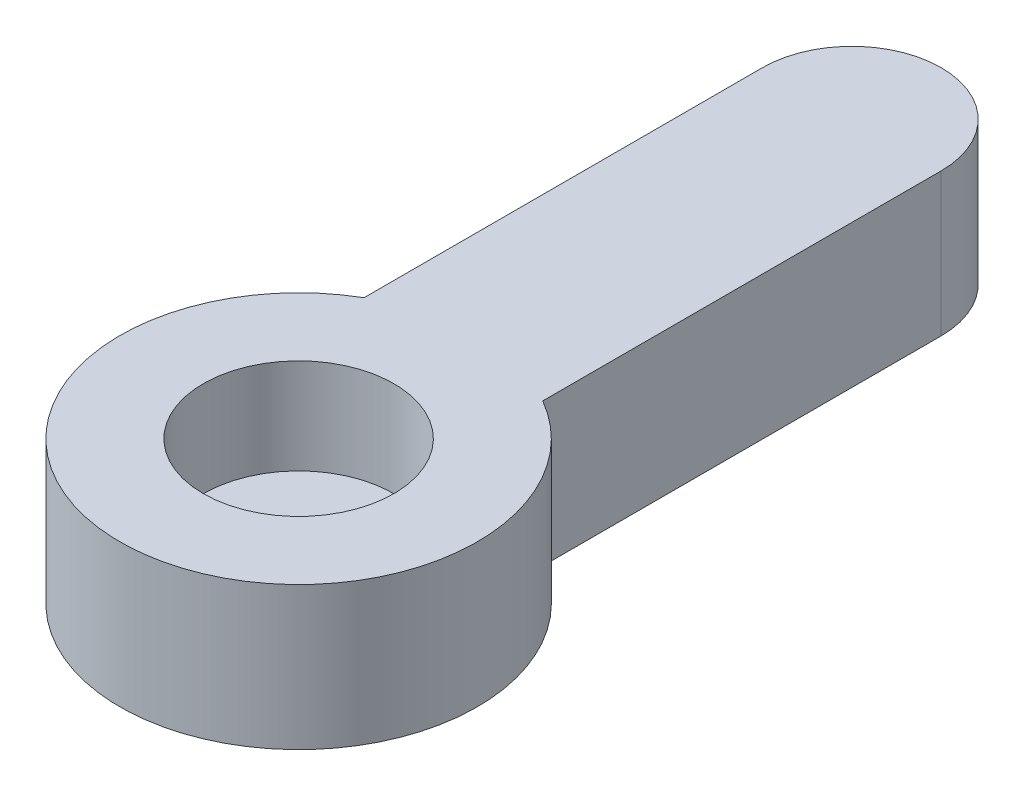
ISO-10303-21;
HEADER;
FILE_DESCRIPTION(('STEP AP214'),'2;1');
FILE_NAME('part.step','',(''),(''),'','','');
FILE_SCHEMA(('AUTOMOTIVE_DESIGN { 1 0 10303 214 1 1 1 1 }'));
ENDSEC;
DATA;
#1=APPLICATION_CONTEXT('core data for automotive mechanical design processes');
#2=APPLICATION_PROTOCOL_DEFINITION('international standard','automotive_design',2000,#1);
#3=PRODUCT_CONTEXT('',#1,'mechanical');
#4=PRODUCT('Part','Part','',(#3));
#5=PRODUCT_RELATED_PRODUCT_CATEGORY('part','',(#4));
#6=PRODUCT_DEFINITION_FORMATION('','',#4);
#7=PRODUCT_DEFINITION_CONTEXT('part definition',#1,'design');
#8=PRODUCT_DEFINITION('design','',#6,#7);
#9=PRODUCT_DEFINITION_SHAPE('','',#8);
#10=(LENGTH_UNIT() NAMED_UNIT(*) SI_UNIT(.MILLI.,.METRE.));
#11=(NAMED_UNIT(*) PLANE_ANGLE_UNIT() SI_UNIT($,.RADIAN.));
#12=(NAMED_UNIT(*) SI_UNIT($,.STERADIAN.) SOLID_ANGLE_UNIT());
#13=UNCERTAINTY_MEASURE_WITH_UNIT(LENGTH_MEASURE(1.E-05),#10,'distance_accuracy_value','');
#14=(GEOMETRIC_REPRESENTATION_CONTEXT(3) GLOBAL_UNCERTAINTY_ASSIGNED_CONTEXT((#13)) GLOBAL_UNIT_ASSIGNED_CONTEXT((#10,
#11,#12)) REPRESENTATION_CONTEXT('',''));
#15=CARTESIAN_POINT('',(0.,0.,0.));
#16=DIRECTION('',(0.,0.,1.));
#17=DIRECTION('',(1.,0.,0.));
#18=AXIS2_PLACEMENT_3D('',#15,#16,#17);
#19=CARTESIAN_POINT('',(-3.75,6.,-13.9951905283833));
#20=DIRECTION('',(-1.,0.,0.));
#21=DIRECTION('',(0.,0.,1.));
#22=AXIS2_PLACEMENT_3D('',#19,#20,#21);
#23=PLANE('',#22);
#24=DIRECTION('',(0.,0.,-1.));
#25=VECTOR('',#24,1.);
#26=CARTESIAN_POINT('',(-3.75,0.,-13.9951905283833));
#27=LINE('',#26,#25);
#28=CARTESIAN_POINT('',(-3.75,0.,-13.9951905283833));
#29=VERTEX_POINT('',#28);
#30=CARTESIAN_POINT('',(-3.75,0.,-30.718752221774));
#31=VERTEX_POINT('',#30);
#32=EDGE_CURVE('E107',#29,#31,#27,.T.);
#33=ORIENTED_EDGE('',*,*,#32,.F.);
#34=DIRECTION('',(0.,-1.,0.));
#35=VECTOR('',#34,1.);
#36=CARTESIAN_POINT('',(-3.75,6.,-13.9951905283833));
#37=LINE('',#36,#35);
#38=CARTESIAN_POINT('',(-3.75,6.,-13.9951905283833));
#39=VERTEX_POINT('',#38);
#40=EDGE_CURVE('E11',#39,#29,#37,.T.);
#41=ORIENTED_EDGE('',*,*,#40,.F.);
#42=DIRECTION('',(0.,0.,-1.));
#43=VECTOR('',#42,1.);
#44=CARTESIAN_POINT('',(-3.75,6.,-13.9951905283833));
#45=LINE('',#44,#43);
#46=CARTESIAN_POINT('',(-3.75,6.,-30.718752221774));
#47=VERTEX_POINT('',#46);
#48=EDGE_CURVE('E101',#39,#47,#45,.T.);
#49=ORIENTED_EDGE('',*,*,#48,.T.);
#50=DIRECTION('',(0.,-1.,0.));
#51=VECTOR('',#50,1.);
#52=CARTESIAN_POINT('',(-3.75,6.,-30.718752221774));
#53=LINE('',#52,#51);
#54=EDGE_CURVE('E44',#47,#31,#53,.T.);
#55=ORIENTED_EDGE('',*,*,#54,.T.);
#56=EDGE_LOOP('',(#33,#41,#49,#55));
#57=FACE_BOUND('',#56,.T.);
#58=ADVANCED_FACE('F41',(#57),#23,.T.);
#59=CARTESIAN_POINT('',(0.,6.,-7.5));
#60=DIRECTION('',(0.,-1.,0.));
#61=DIRECTION('',(0.,0.,-1.));
#62=AXIS2_PLACEMENT_3D('',#59,#60,#61);
#63=CYLINDRICAL_SURFACE('',#62,7.5);
#64=CARTESIAN_POINT('',(0.,0.,-7.5));
#65=DIRECTION('',(0.,1.,0.));
#66=DIRECTION('',(0.,0.,1.));
#67=AXIS2_PLACEMENT_3D('',#64,#65,#66);
#68=CIRCLE('',#67,7.5);
#69=CARTESIAN_POINT('',(3.75,0.,-13.9951905283833));
#70=VERTEX_POINT('',#69);
#71=EDGE_CURVE('E74',#29,#70,#68,.T.);
#72=ORIENTED_EDGE('',*,*,#71,.T.);
#73=DIRECTION('',(0.,-1.,0.));
#74=VECTOR('',#73,1.);
#75=CARTESIAN_POINT('',(3.75,6.,-13.9951905283833));
#76=LINE('',#75,#74);
#77=CARTESIAN_POINT('',(3.75,6.,-13.9951905283833));
#78=VERTEX_POINT('',#77);
#79=EDGE_CURVE('E50',#78,#70,#76,.T.);
#80=ORIENTED_EDGE('',*,*,#79,.F.);
#81=CARTESIAN_POINT('',(0.,6.,-7.5));
#82=DIRECTION('',(0.,1.,0.));
#83=DIRECTION('',(0.,0.,1.));
#84=AXIS2_PLACEMENT_3D('',#81,#82,#83);
#85=CIRCLE('',#84,7.5);
#86=EDGE_CURVE('E91',#39,#78,#85,.T.);
#87=ORIENTED_EDGE('',*,*,#86,.F.);
#88=ORIENTED_EDGE('',*,*,#40,.T.);
#89=EDGE_LOOP('',(#72,#80,#87,#88));
#90=FACE_BOUND('',#89,.T.);
#91=ADVANCED_FACE('F118',(#90),#63,.T.);
#92=CARTESIAN_POINT('',(3.75,6.,-13.9951905283833));
#93=DIRECTION('',(-1.,0.,0.));
#94=DIRECTION('',(0.,0.,1.));
#95=AXIS2_PLACEMENT_3D('',#92,#93,#94);
#96=PLANE('',#95);
#97=DIRECTION('',(0.,0.,-1.));
#98=VECTOR('',#97,1.);
#99=CARTESIAN_POINT('',(3.75,0.,-13.9951905283833));
#100=LINE('',#99,#98);
#101=CARTESIAN_POINT('',(3.75000000000001,0.,-30.718752221774));
#102=VERTEX_POINT('',#101);
#103=EDGE_CURVE('E98',#70,#102,#100,.T.);
#104=ORIENTED_EDGE('',*,*,#103,.T.);
#105=DIRECTION('',(0.,-1.,0.));
#106=VECTOR('',#105,1.);
#107=CARTESIAN_POINT('',(3.75000000000001,6.,-30.718752221774));
#108=LINE('',#107,#106);
#109=CARTESIAN_POINT('',(3.75000000000001,6.,-30.718752221774));
#110=VERTEX_POINT('',#109);
#111=EDGE_CURVE('E95',#110,#102,#108,.T.);
#112=ORIENTED_EDGE('',*,*,#111,.F.);
#113=DIRECTION('',(0.,0.,-1.));
#114=VECTOR('',#113,1.);
#115=CARTESIAN_POINT('',(3.75,6.,-13.9951905283833));
#116=LINE('',#115,#114);
#117=EDGE_CURVE('E86',#78,#110,#116,.T.);
#118=ORIENTED_EDGE('',*,*,#117,.F.);
#119=ORIENTED_EDGE('',*,*,#79,.T.);
#120=EDGE_LOOP('',(#104,#112,#118,#119));
#121=FACE_BOUND('',#120,.T.);
#122=ADVANCED_FACE('F96',(#121),#96,.F.);
#123=CARTESIAN_POINT('',(0.,6.,-30.718752221774));
#124=DIRECTION('',(0.,-1.,0.));
#125=DIRECTION('',(0.,0.,-1.));
#126=AXIS2_PLACEMENT_3D('',#123,#124,#125);
#127=CYLINDRICAL_SURFACE('',#126,3.75);
#128=CARTESIAN_POINT('',(0.,0.,-30.718752221774));
#129=DIRECTION('',(0.,-1.,0.));
#130=DIRECTION('',(0.,0.,-1.));
#131=AXIS2_PLACEMENT_3D('',#128,#129,#130);
#132=CIRCLE('',#131,3.75);
#133=EDGE_CURVE('E110',#31,#102,#132,.T.);
#134=ORIENTED_EDGE('',*,*,#133,.F.);
#135=ORIENTED_EDGE('',*,*,#54,.F.);
#136=CARTESIAN_POINT('',(0.,6.,-30.718752221774));
#137=DIRECTION('',(0.,-1.,0.));
#138=DIRECTION('',(0.,0.,-1.));
#139=AXIS2_PLACEMENT_3D('',#136,#137,#138);
#140=CIRCLE('',#139,3.75);
#141=EDGE_CURVE('E90',#47,#110,#140,.T.);
#142=ORIENTED_EDGE('',*,*,#141,.T.);
#143=ORIENTED_EDGE('',*,*,#111,.T.);
#144=EDGE_LOOP('',(#134,#135,#142,#143));
#145=FACE_BOUND('',#144,.T.);
#146=ADVANCED_FACE('F100',(#145),#127,.T.);
#147=CARTESIAN_POINT('',(0.,6.,-30.718752221774));
#148=DIRECTION('',(0.,-1.,0.));
#149=DIRECTION('',(0.,0.,-1.));
#150=AXIS2_PLACEMENT_3D('',#147,#148,#149);
#151=PLANE('',#150);
#152=CARTESIAN_POINT('',(0.,6.,-7.5003476924447));
#153=DIRECTION('',(0.,1.,0.));
#154=DIRECTION('',(0.,0.,1.));
#155=AXIS2_PLACEMENT_3D('',#152,#153,#154);
#156=CIRCLE('',#155,4.);
#157=CARTESIAN_POINT('',(0.,6.,-3.5003476924447));
#158=VERTEX_POINT('',#157);
#159=EDGE_CURVE('E150',#158,#158,#156,.T.);
#160=ORIENTED_EDGE('',*,*,#159,.F.);
#161=EDGE_LOOP('',(#160));
#162=FACE_BOUND('',#161,.T.);
#163=ORIENTED_EDGE('',*,*,#48,.F.);
#164=ORIENTED_EDGE('',*,*,#86,.T.);
#165=ORIENTED_EDGE('',*,*,#117,.T.);
#166=ORIENTED_EDGE('',*,*,#141,.F.);
#167=EDGE_LOOP('',(#163,#164,#165,#166));
#168=FACE_BOUND('',#167,.T.);
#169=ADVANCED_FACE('F89',(#162,#168),#151,.F.);
#170=CARTESIAN_POINT('',(0.,0.,-30.718752221774));
#171=DIRECTION('',(0.,-1.,0.));
#172=DIRECTION('',(0.,0.,-1.));
#173=AXIS2_PLACEMENT_3D('',#170,#171,#172);
#174=PLANE('',#173);
#175=ORIENTED_EDGE('',*,*,#32,.T.);
#176=ORIENTED_EDGE('',*,*,#133,.T.);
#177=ORIENTED_EDGE('',*,*,#103,.F.);
#178=ORIENTED_EDGE('',*,*,#71,.F.);
#179=EDGE_LOOP('',(#175,#176,#177,#178));
#180=FACE_BOUND('',#179,.T.);
#181=ADVANCED_FACE('F116',(#180),#174,.T.);
#182=CARTESIAN_POINT('',(0.,2.,-7.5003476924447));
#183=DIRECTION('',(0.,1.,0.));
#184=DIRECTION('',(0.,0.,1.));
#185=AXIS2_PLACEMENT_3D('',#182,#183,#184);
#186=CYLINDRICAL_SURFACE('',#185,4.);
#187=CARTESIAN_POINT('',(0.,2.,-7.5003476924447));
#188=DIRECTION('',(0.,1.,0.));
#189=DIRECTION('',(0.,0.,1.));
#190=AXIS2_PLACEMENT_3D('',#187,#188,#189);
#191=CIRCLE('',#190,4.);
#192=CARTESIAN_POINT('',(0.,2.,-3.5003476924447));
#193=VERTEX_POINT('',#192);
#194=EDGE_CURVE('E111',#193,#193,#191,.T.);
#195=ORIENTED_EDGE('',*,*,#194,.F.);
#196=EDGE_LOOP('',(#195));
#197=FACE_BOUND('',#196,.T.);
#198=ORIENTED_EDGE('',*,*,#159,.T.);
#199=EDGE_LOOP('',(#198));
#200=FACE_BOUND('',#199,.T.);
#201=ADVANCED_FACE('F138',(#197,#200),#186,.F.);
#202=CARTESIAN_POINT('',(0.,2.,-7.5003476924447));
#203=DIRECTION('',(0.,1.,0.));
#204=DIRECTION('',(0.,0.,1.));
#205=AXIS2_PLACEMENT_3D('',#202,#203,#204);
#206=PLANE('',#205);
#207=ORIENTED_EDGE('',*,*,#194,.T.);
#208=EDGE_LOOP('',(#207));
#209=FACE_BOUND('',#208,.T.);
#210=ADVANCED_FACE('F142',(#209),#206,.T.);
#211=CLOSED_SHELL('',(#58,#91,#122,#146,#169,#181,#201,#210));
#212=MANIFOLD_SOLID_BREP('B2',#211);
#213=ADVANCED_BREP_SHAPE_REPRESENTATION('',(#18,#212),#14);
#214=SHAPE_DEFINITION_REPRESENTATION(#9,#213);
ENDSEC;
END-ISO-10303-21;
